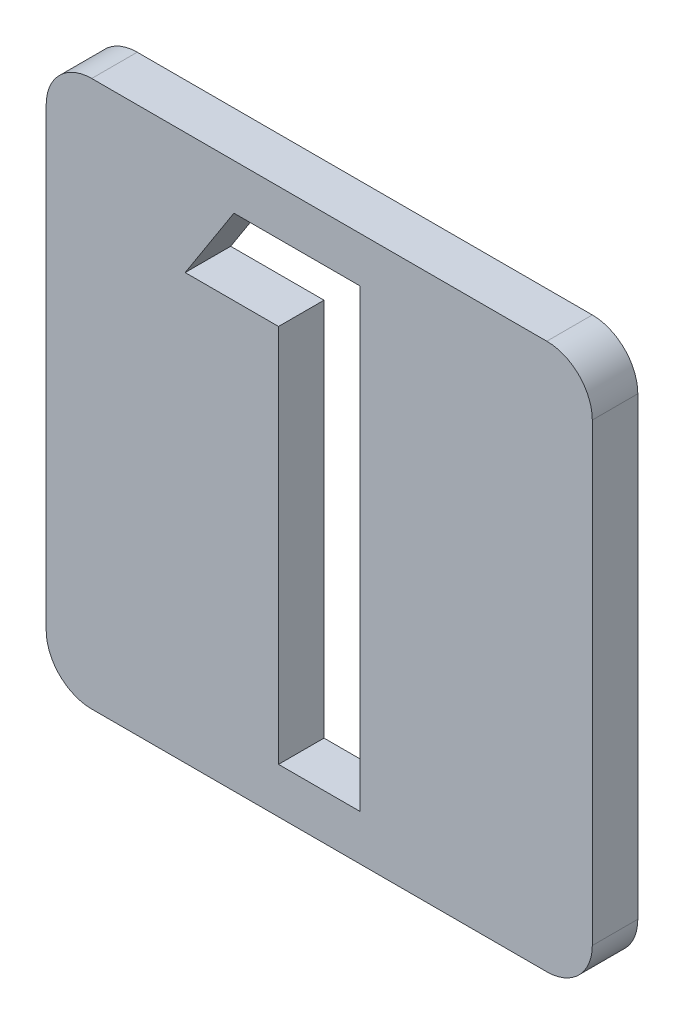
ISO-10303-21;
HEADER;
FILE_DESCRIPTION(('STEP AP214'),'2;1');
FILE_NAME('part.step','',(''),(''),'','','');
FILE_SCHEMA(('AUTOMOTIVE_DESIGN { 1 0 10303 214 1 1 1 1 }'));
ENDSEC;
DATA;
#1=APPLICATION_CONTEXT('core data for automotive mechanical design processes');
#2=APPLICATION_PROTOCOL_DEFINITION('international standard','automotive_design',2000,#1);
#3=PRODUCT_CONTEXT('',#1,'mechanical');
#4=PRODUCT('Part','Part','',(#3));
#5=PRODUCT_RELATED_PRODUCT_CATEGORY('part','',(#4));
#6=PRODUCT_DEFINITION_FORMATION('','',#4);
#7=PRODUCT_DEFINITION_CONTEXT('part definition',#1,'design');
#8=PRODUCT_DEFINITION('design','',#6,#7);
#9=PRODUCT_DEFINITION_SHAPE('','',#8);
#10=(LENGTH_UNIT() NAMED_UNIT(*) SI_UNIT(.MILLI.,.METRE.));
#11=(NAMED_UNIT(*) PLANE_ANGLE_UNIT() SI_UNIT($,.RADIAN.));
#12=(NAMED_UNIT(*) SI_UNIT($,.STERADIAN.) SOLID_ANGLE_UNIT());
#13=UNCERTAINTY_MEASURE_WITH_UNIT(LENGTH_MEASURE(1.E-05),#10,'distance_accuracy_value','');
#14=(GEOMETRIC_REPRESENTATION_CONTEXT(3) GLOBAL_UNCERTAINTY_ASSIGNED_CONTEXT((#13)) GLOBAL_UNIT_ASSIGNED_CONTEXT((#10,
#11,#12)) REPRESENTATION_CONTEXT('',''));
#15=CARTESIAN_POINT('',(0.,0.,0.));
#16=DIRECTION('',(0.,0.,1.));
#17=DIRECTION('',(1.,0.,0.));
#18=AXIS2_PLACEMENT_3D('',#15,#16,#17);
#19=CARTESIAN_POINT('',(50.,50.,10.));
#20=DIRECTION('',(0.,0.,-1.));
#21=DIRECTION('',(-1.,0.,0.));
#22=AXIS2_PLACEMENT_3D('',#19,#20,#21);
#23=PLANE('',#22);
#24=DIRECTION('',(1.,0.,0.));
#25=VECTOR('',#24,1.);
#26=CARTESIAN_POINT('',(-49.9999999999999,60.,10.));
#27=LINE('',#26,#25);
#28=CARTESIAN_POINT('',(-49.9999999999999,60.,10.));
#29=VERTEX_POINT('',#28);
#30=CARTESIAN_POINT('',(49.9999999999999,60.,10.));
#31=VERTEX_POINT('',#30);
#32=EDGE_CURVE('E187',#29,#31,#27,.T.);
#33=ORIENTED_EDGE('',*,*,#32,.F.);
#34=CARTESIAN_POINT('',(-50.,50.,10.));
#35=DIRECTION('',(0.,0.,1.));
#36=DIRECTION('',(1.,0.,0.));
#37=AXIS2_PLACEMENT_3D('',#34,#35,#36);
#38=CIRCLE('',#37,10.);
#39=CARTESIAN_POINT('',(-60.,49.9999999999999,10.));
#40=VERTEX_POINT('',#39);
#41=EDGE_CURVE('E205',#29,#40,#38,.T.);
#42=ORIENTED_EDGE('',*,*,#41,.T.);
#43=DIRECTION('',(0.,-1.,0.));
#44=VECTOR('',#43,1.);
#45=CARTESIAN_POINT('',(-60.,49.9999999999999,10.));
#46=LINE('',#45,#44);
#47=CARTESIAN_POINT('',(-60.,-49.9999999999999,10.));
#48=VERTEX_POINT('',#47);
#49=EDGE_CURVE('E203',#40,#48,#46,.T.);
#50=ORIENTED_EDGE('',*,*,#49,.T.);
#51=CARTESIAN_POINT('',(-50.,-50.,10.));
#52=DIRECTION('',(0.,0.,1.));
#53=DIRECTION('',(1.,0.,0.));
#54=AXIS2_PLACEMENT_3D('',#51,#52,#53);
#55=CIRCLE('',#54,10.);
#56=CARTESIAN_POINT('',(-49.9999999999999,-60.,10.));
#57=VERTEX_POINT('',#56);
#58=EDGE_CURVE('E201',#48,#57,#55,.T.);
#59=ORIENTED_EDGE('',*,*,#58,.T.);
#60=DIRECTION('',(1.,0.,0.));
#61=VECTOR('',#60,1.);
#62=CARTESIAN_POINT('',(-49.9999999999999,-60.,10.));
#63=LINE('',#62,#61);
#64=CARTESIAN_POINT('',(49.9999999999999,-60.,10.));
#65=VERTEX_POINT('',#64);
#66=EDGE_CURVE('E199',#57,#65,#63,.T.);
#67=ORIENTED_EDGE('',*,*,#66,.T.);
#68=CARTESIAN_POINT('',(50.,-50.,10.));
#69=DIRECTION('',(0.,0.,1.));
#70=DIRECTION('',(1.,0.,0.));
#71=AXIS2_PLACEMENT_3D('',#68,#69,#70);
#72=CIRCLE('',#71,10.);
#73=CARTESIAN_POINT('',(60.,-50.,10.));
#74=VERTEX_POINT('',#73);
#75=EDGE_CURVE('E197',#65,#74,#72,.T.);
#76=ORIENTED_EDGE('',*,*,#75,.T.);
#77=DIRECTION('',(0.,-1.,0.));
#78=VECTOR('',#77,1.);
#79=CARTESIAN_POINT('',(60.,49.9999999999999,10.));
#80=LINE('',#79,#78);
#81=CARTESIAN_POINT('',(60.,49.9999999999999,10.));
#82=VERTEX_POINT('',#81);
#83=EDGE_CURVE('E194',#82,#74,#80,.T.);
#84=ORIENTED_EDGE('',*,*,#83,.F.);
#85=CARTESIAN_POINT('',(50.,50.,10.));
#86=DIRECTION('',(0.,0.,-1.));
#87=DIRECTION('',(-1.,0.,0.));
#88=AXIS2_PLACEMENT_3D('',#85,#86,#87);
#89=CIRCLE('',#88,10.);
#90=EDGE_CURVE('E190',#31,#82,#89,.T.);
#91=ORIENTED_EDGE('',*,*,#90,.F.);
#92=EDGE_LOOP('',(#33,#42,#50,#59,#67,#76,#84,#91));
#93=FACE_BOUND('',#92,.T.);
#94=DIRECTION('',(0.540859777503418,0.841112775481952,0.));
#95=VECTOR('',#94,1.);
#96=CARTESIAN_POINT('',(-29.4615384615385,33.3333333333333,10.));
#97=LINE('',#96,#95);
#98=CARTESIAN_POINT('',(-29.4615384615385,33.3333333333333,10.));
#99=VERTEX_POINT('',#98);
#100=CARTESIAN_POINT('',(-18.744391025641,50.,10.));
#101=VERTEX_POINT('',#100);
#102=EDGE_CURVE('E50',#99,#101,#97,.T.);
#103=ORIENTED_EDGE('',*,*,#102,.T.);
#104=DIRECTION('',(1.,0.,0.));
#105=VECTOR('',#104,1.);
#106=CARTESIAN_POINT('',(-18.744391025641,50.,10.));
#107=LINE('',#106,#105);
#108=CARTESIAN_POINT('',(9.,50.,10.));
#109=VERTEX_POINT('',#108);
#110=EDGE_CURVE('E150',#101,#109,#107,.T.);
#111=ORIENTED_EDGE('',*,*,#110,.T.);
#112=DIRECTION('',(0.,-1.,0.));
#113=VECTOR('',#112,1.);
#114=CARTESIAN_POINT('',(9.,50.,10.));
#115=LINE('',#114,#113);
#116=CARTESIAN_POINT('',(9.,-50.,10.));
#117=VERTEX_POINT('',#116);
#118=EDGE_CURVE('E169',#109,#117,#115,.T.);
#119=ORIENTED_EDGE('',*,*,#118,.T.);
#120=DIRECTION('',(-1.,0.,0.));
#121=VECTOR('',#120,1.);
#122=CARTESIAN_POINT('',(9.,-50.,10.));
#123=LINE('',#122,#121);
#124=CARTESIAN_POINT('',(-8.94871794871795,-50.,10.));
#125=VERTEX_POINT('',#124);
#126=EDGE_CURVE('E172',#117,#125,#123,.T.);
#127=ORIENTED_EDGE('',*,*,#126,.T.);
#128=DIRECTION('',(0.,1.,0.));
#129=VECTOR('',#128,1.);
#130=CARTESIAN_POINT('',(-8.94871794871795,-50.,10.));
#131=LINE('',#130,#129);
#132=CARTESIAN_POINT('',(-8.94871794871795,33.3333333333333,10.));
#133=VERTEX_POINT('',#132);
#134=EDGE_CURVE('E175',#125,#133,#131,.T.);
#135=ORIENTED_EDGE('',*,*,#134,.T.);
#136=DIRECTION('',(-1.,0.,0.));
#137=VECTOR('',#136,1.);
#138=CARTESIAN_POINT('',(-8.94871794871795,33.3333333333333,10.));
#139=LINE('',#138,#137);
#140=EDGE_CURVE('E144',#133,#99,#139,.T.);
#141=ORIENTED_EDGE('',*,*,#140,.T.);
#142=EDGE_LOOP('',(#103,#111,#119,#127,#135,#141));
#143=FACE_BOUND('',#142,.T.);
#144=ADVANCED_FACE('F33',(#93,#143),#23,.F.);
#145=CARTESIAN_POINT('',(50.,50.,0.));
#146=DIRECTION('',(0.,0.,-1.));
#147=DIRECTION('',(-1.,0.,0.));
#148=AXIS2_PLACEMENT_3D('',#145,#146,#147);
#149=PLANE('',#148);
#150=DIRECTION('',(1.,0.,0.));
#151=VECTOR('',#150,1.);
#152=CARTESIAN_POINT('',(-49.9999999999999,60.,0.));
#153=LINE('',#152,#151);
#154=CARTESIAN_POINT('',(-49.9999999999999,60.,0.));
#155=VERTEX_POINT('',#154);
#156=CARTESIAN_POINT('',(49.9999999999999,60.,0.));
#157=VERTEX_POINT('',#156);
#158=EDGE_CURVE('E151',#155,#157,#153,.T.);
#159=ORIENTED_EDGE('',*,*,#158,.T.);
#160=CARTESIAN_POINT('',(50.,50.,0.));
#161=DIRECTION('',(0.,0.,-1.));
#162=DIRECTION('',(-1.,0.,0.));
#163=AXIS2_PLACEMENT_3D('',#160,#161,#162);
#164=CIRCLE('',#163,10.);
#165=CARTESIAN_POINT('',(60.,49.9999999999999,0.));
#166=VERTEX_POINT('',#165);
#167=EDGE_CURVE('E209',#157,#166,#164,.T.);
#168=ORIENTED_EDGE('',*,*,#167,.T.);
#169=DIRECTION('',(0.,-1.,0.));
#170=VECTOR('',#169,1.);
#171=CARTESIAN_POINT('',(60.,49.9999999999999,0.));
#172=LINE('',#171,#170);
#173=CARTESIAN_POINT('',(60.,-50.,0.));
#174=VERTEX_POINT('',#173);
#175=EDGE_CURVE('E212',#166,#174,#172,.T.);
#176=ORIENTED_EDGE('',*,*,#175,.T.);
#177=CARTESIAN_POINT('',(50.,-50.,0.));
#178=DIRECTION('',(0.,0.,1.));
#179=DIRECTION('',(1.,0.,0.));
#180=AXIS2_PLACEMENT_3D('',#177,#178,#179);
#181=CIRCLE('',#180,10.);
#182=CARTESIAN_POINT('',(49.9999999999999,-60.,0.));
#183=VERTEX_POINT('',#182);
#184=EDGE_CURVE('E215',#183,#174,#181,.T.);
#185=ORIENTED_EDGE('',*,*,#184,.F.);
#186=DIRECTION('',(1.,0.,0.));
#187=VECTOR('',#186,1.);
#188=CARTESIAN_POINT('',(-49.9999999999999,-60.,0.));
#189=LINE('',#188,#187);
#190=CARTESIAN_POINT('',(-49.9999999999999,-60.,0.));
#191=VERTEX_POINT('',#190);
#192=EDGE_CURVE('E218',#191,#183,#189,.T.);
#193=ORIENTED_EDGE('',*,*,#192,.F.);
#194=CARTESIAN_POINT('',(-50.,-50.,0.));
#195=DIRECTION('',(0.,0.,1.));
#196=DIRECTION('',(1.,0.,0.));
#197=AXIS2_PLACEMENT_3D('',#194,#195,#196);
#198=CIRCLE('',#197,10.);
#199=CARTESIAN_POINT('',(-60.,-49.9999999999999,0.));
#200=VERTEX_POINT('',#199);
#201=EDGE_CURVE('E220',#200,#191,#198,.T.);
#202=ORIENTED_EDGE('',*,*,#201,.F.);
#203=DIRECTION('',(0.,-1.,0.));
#204=VECTOR('',#203,1.);
#205=CARTESIAN_POINT('',(-60.,49.9999999999999,0.));
#206=LINE('',#205,#204);
#207=CARTESIAN_POINT('',(-60.,49.9999999999999,0.));
#208=VERTEX_POINT('',#207);
#209=EDGE_CURVE('E222',#208,#200,#206,.T.);
#210=ORIENTED_EDGE('',*,*,#209,.F.);
#211=CARTESIAN_POINT('',(-50.,50.,0.));
#212=DIRECTION('',(0.,0.,1.));
#213=DIRECTION('',(1.,0.,0.));
#214=AXIS2_PLACEMENT_3D('',#211,#212,#213);
#215=CIRCLE('',#214,10.);
#216=EDGE_CURVE('E191',#155,#208,#215,.T.);
#217=ORIENTED_EDGE('',*,*,#216,.F.);
#218=EDGE_LOOP('',(#159,#168,#176,#185,#193,#202,#210,#217));
#219=FACE_BOUND('',#218,.T.);
#220=DIRECTION('',(1.,0.,0.));
#221=VECTOR('',#220,1.);
#222=CARTESIAN_POINT('',(-18.744391025641,50.,0.));
#223=LINE('',#222,#221);
#224=CARTESIAN_POINT('',(-18.744391025641,50.,0.));
#225=VERTEX_POINT('',#224);
#226=CARTESIAN_POINT('',(9.,50.,0.));
#227=VERTEX_POINT('',#226);
#228=EDGE_CURVE('E143',#225,#227,#223,.T.);
#229=ORIENTED_EDGE('',*,*,#228,.F.);
#230=DIRECTION('',(0.540859777503418,0.841112775481952,0.));
#231=VECTOR('',#230,1.);
#232=CARTESIAN_POINT('',(-29.4615384615385,33.3333333333333,0.));
#233=LINE('',#232,#231);
#234=CARTESIAN_POINT('',(-29.4615384615385,33.3333333333333,0.));
#235=VERTEX_POINT('',#234);
#236=EDGE_CURVE('E135',#235,#225,#233,.T.);
#237=ORIENTED_EDGE('',*,*,#236,.F.);
#238=DIRECTION('',(-1.,0.,0.));
#239=VECTOR('',#238,1.);
#240=CARTESIAN_POINT('',(-8.94871794871795,33.3333333333333,0.));
#241=LINE('',#240,#239);
#242=CARTESIAN_POINT('',(-8.94871794871795,33.3333333333333,0.));
#243=VERTEX_POINT('',#242);
#244=EDGE_CURVE('E165',#243,#235,#241,.T.);
#245=ORIENTED_EDGE('',*,*,#244,.F.);
#246=DIRECTION('',(0.,1.,0.));
#247=VECTOR('',#246,1.);
#248=CARTESIAN_POINT('',(-8.94871794871795,-50.,0.));
#249=LINE('',#248,#247);
#250=CARTESIAN_POINT('',(-8.94871794871795,-50.,0.));
#251=VERTEX_POINT('',#250);
#252=EDGE_CURVE('E163',#251,#243,#249,.T.);
#253=ORIENTED_EDGE('',*,*,#252,.F.);
#254=DIRECTION('',(-1.,0.,0.));
#255=VECTOR('',#254,1.);
#256=CARTESIAN_POINT('',(9.,-50.,0.));
#257=LINE('',#256,#255);
#258=CARTESIAN_POINT('',(9.,-50.,0.));
#259=VERTEX_POINT('',#258);
#260=EDGE_CURVE('E159',#259,#251,#257,.T.);
#261=ORIENTED_EDGE('',*,*,#260,.F.);
#262=DIRECTION('',(0.,-1.,0.));
#263=VECTOR('',#262,1.);
#264=CARTESIAN_POINT('',(9.,50.,0.));
#265=LINE('',#264,#263);
#266=EDGE_CURVE('E157',#227,#259,#265,.T.);
#267=ORIENTED_EDGE('',*,*,#266,.F.);
#268=EDGE_LOOP('',(#229,#237,#245,#253,#261,#267));
#269=FACE_BOUND('',#268,.T.);
#270=ADVANCED_FACE('F155',(#219,#269),#149,.T.);
#271=CARTESIAN_POINT('',(-49.9999999999999,60.,10.));
#272=DIRECTION('',(0.,1.,0.));
#273=DIRECTION('',(0.,0.,1.));
#274=AXIS2_PLACEMENT_3D('',#271,#272,#273);
#275=PLANE('',#274);
#276=ORIENTED_EDGE('',*,*,#158,.F.);
#277=DIRECTION('',(0.,0.,-1.));
#278=VECTOR('',#277,1.);
#279=CARTESIAN_POINT('',(-49.9999999999999,60.,10.));
#280=LINE('',#279,#278);
#281=EDGE_CURVE('E11',#29,#155,#280,.T.);
#282=ORIENTED_EDGE('',*,*,#281,.F.);
#283=ORIENTED_EDGE('',*,*,#32,.T.);
#284=DIRECTION('',(0.,0.,-1.));
#285=VECTOR('',#284,1.);
#286=CARTESIAN_POINT('',(49.9999999999999,60.,10.));
#287=LINE('',#286,#285);
#288=EDGE_CURVE('E37',#31,#157,#287,.T.);
#289=ORIENTED_EDGE('',*,*,#288,.T.);
#290=EDGE_LOOP('',(#276,#282,#283,#289));
#291=FACE_BOUND('',#290,.T.);
#292=ADVANCED_FACE('F35',(#291),#275,.T.);
#293=CARTESIAN_POINT('',(-50.,50.,10.));
#294=DIRECTION('',(0.,0.,-1.));
#295=DIRECTION('',(-1.,0.,0.));
#296=AXIS2_PLACEMENT_3D('',#293,#294,#295);
#297=CYLINDRICAL_SURFACE('',#296,10.);
#298=ORIENTED_EDGE('',*,*,#216,.T.);
#299=DIRECTION('',(0.,0.,-1.));
#300=VECTOR('',#299,1.);
#301=CARTESIAN_POINT('',(-60.,49.9999999999999,10.));
#302=LINE('',#301,#300);
#303=EDGE_CURVE('E42',#40,#208,#302,.T.);
#304=ORIENTED_EDGE('',*,*,#303,.F.);
#305=ORIENTED_EDGE('',*,*,#41,.F.);
#306=ORIENTED_EDGE('',*,*,#281,.T.);
#307=EDGE_LOOP('',(#298,#304,#305,#306));
#308=FACE_BOUND('',#307,.T.);
#309=ADVANCED_FACE('F252',(#308),#297,.T.);
#310=CARTESIAN_POINT('',(-60.,49.9999999999999,10.));
#311=DIRECTION('',(1.,0.,0.));
#312=DIRECTION('',(0.,1.,0.));
#313=AXIS2_PLACEMENT_3D('',#310,#311,#312);
#314=PLANE('',#313);
#315=ORIENTED_EDGE('',*,*,#209,.T.);
#316=DIRECTION('',(0.,0.,-1.));
#317=VECTOR('',#316,1.);
#318=CARTESIAN_POINT('',(-60.,-49.9999999999999,10.));
#319=LINE('',#318,#317);
#320=EDGE_CURVE('E227',#48,#200,#319,.T.);
#321=ORIENTED_EDGE('',*,*,#320,.F.);
#322=ORIENTED_EDGE('',*,*,#49,.F.);
#323=ORIENTED_EDGE('',*,*,#303,.T.);
#324=EDGE_LOOP('',(#315,#321,#322,#323));
#325=FACE_BOUND('',#324,.T.);
#326=ADVANCED_FACE('F256',(#325),#314,.F.);
#327=CARTESIAN_POINT('',(-50.,-50.,10.));
#328=DIRECTION('',(0.,0.,-1.));
#329=DIRECTION('',(-1.,0.,0.));
#330=AXIS2_PLACEMENT_3D('',#327,#328,#329);
#331=CYLINDRICAL_SURFACE('',#330,10.);
#332=ORIENTED_EDGE('',*,*,#201,.T.);
#333=DIRECTION('',(0.,0.,-1.));
#334=VECTOR('',#333,1.);
#335=CARTESIAN_POINT('',(-49.9999999999999,-60.,10.));
#336=LINE('',#335,#334);
#337=EDGE_CURVE('E230',#57,#191,#336,.T.);
#338=ORIENTED_EDGE('',*,*,#337,.F.);
#339=ORIENTED_EDGE('',*,*,#58,.F.);
#340=ORIENTED_EDGE('',*,*,#320,.T.);
#341=EDGE_LOOP('',(#332,#338,#339,#340));
#342=FACE_BOUND('',#341,.T.);
#343=ADVANCED_FACE('F276',(#342),#331,.T.);
#344=CARTESIAN_POINT('',(-49.9999999999999,-60.,10.));
#345=DIRECTION('',(0.,1.,0.));
#346=DIRECTION('',(0.,0.,1.));
#347=AXIS2_PLACEMENT_3D('',#344,#345,#346);
#348=PLANE('',#347);
#349=ORIENTED_EDGE('',*,*,#192,.T.);
#350=DIRECTION('',(0.,0.,-1.));
#351=VECTOR('',#350,1.);
#352=CARTESIAN_POINT('',(49.9999999999999,-60.,10.));
#353=LINE('',#352,#351);
#354=EDGE_CURVE('E233',#65,#183,#353,.T.);
#355=ORIENTED_EDGE('',*,*,#354,.F.);
#356=ORIENTED_EDGE('',*,*,#66,.F.);
#357=ORIENTED_EDGE('',*,*,#337,.T.);
#358=EDGE_LOOP('',(#349,#355,#356,#357));
#359=FACE_BOUND('',#358,.T.);
#360=ADVANCED_FACE('F274',(#359),#348,.F.);
#361=CARTESIAN_POINT('',(50.,-50.,10.));
#362=DIRECTION('',(0.,0.,-1.));
#363=DIRECTION('',(-1.,0.,0.));
#364=AXIS2_PLACEMENT_3D('',#361,#362,#363);
#365=CYLINDRICAL_SURFACE('',#364,10.);
#366=ORIENTED_EDGE('',*,*,#184,.T.);
#367=DIRECTION('',(0.,0.,-1.));
#368=VECTOR('',#367,1.);
#369=CARTESIAN_POINT('',(60.,-50.,10.));
#370=LINE('',#369,#368);
#371=EDGE_CURVE('E236',#74,#174,#370,.T.);
#372=ORIENTED_EDGE('',*,*,#371,.F.);
#373=ORIENTED_EDGE('',*,*,#75,.F.);
#374=ORIENTED_EDGE('',*,*,#354,.T.);
#375=EDGE_LOOP('',(#366,#372,#373,#374));
#376=FACE_BOUND('',#375,.T.);
#377=ADVANCED_FACE('F270',(#376),#365,.T.);
#378=CARTESIAN_POINT('',(60.,49.9999999999999,10.));
#379=DIRECTION('',(1.,0.,0.));
#380=DIRECTION('',(0.,1.,0.));
#381=AXIS2_PLACEMENT_3D('',#378,#379,#380);
#382=PLANE('',#381);
#383=ORIENTED_EDGE('',*,*,#175,.F.);
#384=DIRECTION('',(0.,0.,-1.));
#385=VECTOR('',#384,1.);
#386=CARTESIAN_POINT('',(60.,49.9999999999999,10.));
#387=LINE('',#386,#385);
#388=EDGE_CURVE('E237',#82,#166,#387,.T.);
#389=ORIENTED_EDGE('',*,*,#388,.F.);
#390=ORIENTED_EDGE('',*,*,#83,.T.);
#391=ORIENTED_EDGE('',*,*,#371,.T.);
#392=EDGE_LOOP('',(#383,#389,#390,#391));
#393=FACE_BOUND('',#392,.T.);
#394=ADVANCED_FACE('F266',(#393),#382,.T.);
#395=CARTESIAN_POINT('',(50.,50.,10.));
#396=DIRECTION('',(0.,0.,-1.));
#397=DIRECTION('',(-1.,0.,0.));
#398=AXIS2_PLACEMENT_3D('',#395,#396,#397);
#399=CYLINDRICAL_SURFACE('',#398,10.);
#400=ORIENTED_EDGE('',*,*,#167,.F.);
#401=ORIENTED_EDGE('',*,*,#288,.F.);
#402=ORIENTED_EDGE('',*,*,#90,.T.);
#403=ORIENTED_EDGE('',*,*,#388,.T.);
#404=EDGE_LOOP('',(#400,#401,#402,#403));
#405=FACE_BOUND('',#404,.T.);
#406=ADVANCED_FACE('F245',(#405),#399,.T.);
#407=CARTESIAN_POINT('',(-29.4615384615385,33.3333333333333,0.));
#408=DIRECTION('',(0.841112775481952,-0.540859777503418,0.));
#409=DIRECTION('',(0.540859777503418,0.841112775481952,0.));
#410=AXIS2_PLACEMENT_3D('',#407,#408,#409);
#411=PLANE('',#410);
#412=ORIENTED_EDGE('',*,*,#102,.F.);
#413=DIRECTION('',(0.,0.,1.));
#414=VECTOR('',#413,1.);
#415=CARTESIAN_POINT('',(-29.4615384615385,33.3333333333333,0.));
#416=LINE('',#415,#414);
#417=EDGE_CURVE('E139',#235,#99,#416,.T.);
#418=ORIENTED_EDGE('',*,*,#417,.F.);
#419=ORIENTED_EDGE('',*,*,#236,.T.);
#420=DIRECTION('',(0.,0.,1.));
#421=VECTOR('',#420,1.);
#422=CARTESIAN_POINT('',(-18.744391025641,50.,0.));
#423=LINE('',#422,#421);
#424=EDGE_CURVE('E138',#225,#101,#423,.T.);
#425=ORIENTED_EDGE('',*,*,#424,.T.);
#426=EDGE_LOOP('',(#412,#418,#419,#425));
#427=FACE_BOUND('',#426,.T.);
#428=ADVANCED_FACE('F137',(#427),#411,.T.);
#429=CARTESIAN_POINT('',(-18.744391025641,50.,0.));
#430=DIRECTION('',(0.,-1.,0.));
#431=DIRECTION('',(0.,0.,-1.));
#432=AXIS2_PLACEMENT_3D('',#429,#430,#431);
#433=PLANE('',#432);
#434=ORIENTED_EDGE('',*,*,#110,.F.);
#435=ORIENTED_EDGE('',*,*,#424,.F.);
#436=ORIENTED_EDGE('',*,*,#228,.T.);
#437=DIRECTION('',(0.,0.,1.));
#438=VECTOR('',#437,1.);
#439=CARTESIAN_POINT('',(9.,50.,0.));
#440=LINE('',#439,#438);
#441=EDGE_CURVE('E152',#227,#109,#440,.T.);
#442=ORIENTED_EDGE('',*,*,#441,.T.);
#443=EDGE_LOOP('',(#434,#435,#436,#442));
#444=FACE_BOUND('',#443,.T.);
#445=ADVANCED_FACE('F147',(#444),#433,.T.);
#446=CARTESIAN_POINT('',(9.,50.,0.));
#447=DIRECTION('',(-1.,0.,0.));
#448=DIRECTION('',(0.,0.,1.));
#449=AXIS2_PLACEMENT_3D('',#446,#447,#448);
#450=PLANE('',#449);
#451=ORIENTED_EDGE('',*,*,#118,.F.);
#452=ORIENTED_EDGE('',*,*,#441,.F.);
#453=ORIENTED_EDGE('',*,*,#266,.T.);
#454=DIRECTION('',(0.,0.,1.));
#455=VECTOR('',#454,1.);
#456=CARTESIAN_POINT('',(9.,-50.,0.));
#457=LINE('',#456,#455);
#458=EDGE_CURVE('E184',#259,#117,#457,.T.);
#459=ORIENTED_EDGE('',*,*,#458,.T.);
#460=EDGE_LOOP('',(#451,#452,#453,#459));
#461=FACE_BOUND('',#460,.T.);
#462=ADVANCED_FACE('F325',(#461),#450,.T.);
#463=CARTESIAN_POINT('',(9.,-50.,0.));
#464=DIRECTION('',(0.,1.,0.));
#465=DIRECTION('',(0.,0.,1.));
#466=AXIS2_PLACEMENT_3D('',#463,#464,#465);
#467=PLANE('',#466);
#468=ORIENTED_EDGE('',*,*,#126,.F.);
#469=ORIENTED_EDGE('',*,*,#458,.F.);
#470=ORIENTED_EDGE('',*,*,#260,.T.);
#471=DIRECTION('',(0.,0.,1.));
#472=VECTOR('',#471,1.);
#473=CARTESIAN_POINT('',(-8.94871794871795,-50.,0.));
#474=LINE('',#473,#472);
#475=EDGE_CURVE('E182',#251,#125,#474,.T.);
#476=ORIENTED_EDGE('',*,*,#475,.T.);
#477=EDGE_LOOP('',(#468,#469,#470,#476));
#478=FACE_BOUND('',#477,.T.);
#479=ADVANCED_FACE('F333',(#478),#467,.T.);
#480=CARTESIAN_POINT('',(-8.94871794871795,-50.,0.));
#481=DIRECTION('',(1.,0.,0.));
#482=DIRECTION('',(0.,0.,-1.));
#483=AXIS2_PLACEMENT_3D('',#480,#481,#482);
#484=PLANE('',#483);
#485=ORIENTED_EDGE('',*,*,#134,.F.);
#486=ORIENTED_EDGE('',*,*,#475,.F.);
#487=ORIENTED_EDGE('',*,*,#252,.T.);
#488=DIRECTION('',(0.,0.,1.));
#489=VECTOR('',#488,1.);
#490=CARTESIAN_POINT('',(-8.94871794871795,33.3333333333333,0.));
#491=LINE('',#490,#489);
#492=EDGE_CURVE('E58',#243,#133,#491,.T.);
#493=ORIENTED_EDGE('',*,*,#492,.T.);
#494=EDGE_LOOP('',(#485,#486,#487,#493));
#495=FACE_BOUND('',#494,.T.);
#496=ADVANCED_FACE('F343',(#495),#484,.T.);
#497=CARTESIAN_POINT('',(-8.94871794871795,33.3333333333333,0.));
#498=DIRECTION('',(0.,1.,0.));
#499=DIRECTION('',(0.,0.,1.));
#500=AXIS2_PLACEMENT_3D('',#497,#498,#499);
#501=PLANE('',#500);
#502=ORIENTED_EDGE('',*,*,#140,.F.);
#503=ORIENTED_EDGE('',*,*,#492,.F.);
#504=ORIENTED_EDGE('',*,*,#244,.T.);
#505=ORIENTED_EDGE('',*,*,#417,.T.);
#506=EDGE_LOOP('',(#502,#503,#504,#505));
#507=FACE_BOUND('',#506,.T.);
#508=ADVANCED_FACE('F353',(#507),#501,.T.);
#509=CLOSED_SHELL('',(#144,#270,#292,#309,#326,#343,#360,#377,#394,#406,#428,#445,#462,#479,
#496,#508));
#510=MANIFOLD_SOLID_BREP('B2',#509);
#511=ADVANCED_BREP_SHAPE_REPRESENTATION('',(#18,#510),#14);
#512=SHAPE_DEFINITION_REPRESENTATION(#9,#511);
ENDSEC;
END-ISO-10303-21;
